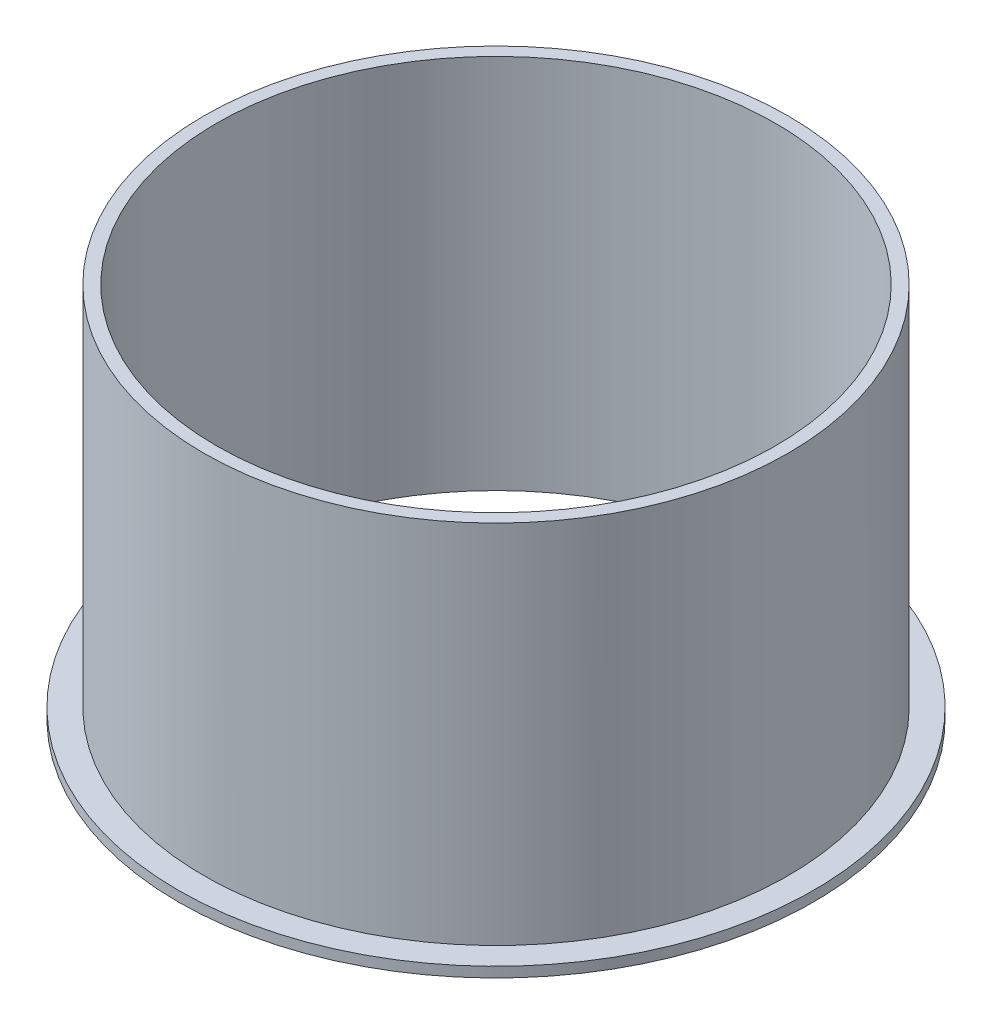
ISO-10303-21;
HEADER;
FILE_DESCRIPTION(('STEP AP214'),'2;1');
FILE_NAME('part.step','',(''),(''),'','','');
FILE_SCHEMA(('AUTOMOTIVE_DESIGN { 1 0 10303 214 1 1 1 1 }'));
ENDSEC;
DATA;
#1=APPLICATION_CONTEXT('core data for automotive mechanical design processes');
#2=APPLICATION_PROTOCOL_DEFINITION('international standard','automotive_design',2000,#1);
#3=PRODUCT_CONTEXT('',#1,'mechanical');
#4=PRODUCT('Part','Part','',(#3));
#5=PRODUCT_RELATED_PRODUCT_CATEGORY('part','',(#4));
#6=PRODUCT_DEFINITION_FORMATION('','',#4);
#7=PRODUCT_DEFINITION_CONTEXT('part definition',#1,'design');
#8=PRODUCT_DEFINITION('design','',#6,#7);
#9=PRODUCT_DEFINITION_SHAPE('','',#8);
#10=(LENGTH_UNIT() NAMED_UNIT(*) SI_UNIT(.MILLI.,.METRE.));
#11=(NAMED_UNIT(*) PLANE_ANGLE_UNIT() SI_UNIT($,.RADIAN.));
#12=(NAMED_UNIT(*) SI_UNIT($,.STERADIAN.) SOLID_ANGLE_UNIT());
#13=UNCERTAINTY_MEASURE_WITH_UNIT(LENGTH_MEASURE(1.E-05),#10,'distance_accuracy_value','');
#14=(GEOMETRIC_REPRESENTATION_CONTEXT(3) GLOBAL_UNCERTAINTY_ASSIGNED_CONTEXT((#13)) GLOBAL_UNIT_ASSIGNED_CONTEXT((#10,
#11,#12)) REPRESENTATION_CONTEXT('',''));
#15=CARTESIAN_POINT('',(0.,0.,0.));
#16=DIRECTION('',(0.,0.,1.));
#17=DIRECTION('',(1.,0.,0.));
#18=AXIS2_PLACEMENT_3D('',#15,#16,#17);
#19=CARTESIAN_POINT('',(0.,74.,0.));
#20=DIRECTION('',(0.,-1.,0.));
#21=DIRECTION('',(0.,0.,-1.));
#22=AXIS2_PLACEMENT_3D('',#19,#20,#21);
#23=CYLINDRICAL_SURFACE('',#22,57.5);
#24=CARTESIAN_POINT('',(0.,74.,0.));
#25=DIRECTION('',(0.,1.,0.));
#26=DIRECTION('',(0.,0.,1.));
#27=AXIS2_PLACEMENT_3D('',#24,#25,#26);
#28=CIRCLE('',#27,57.5);
#29=CARTESIAN_POINT('',(0.,74.,57.5));
#30=VERTEX_POINT('',#29);
#31=EDGE_CURVE('E44',#30,#30,#28,.T.);
#32=ORIENTED_EDGE('',*,*,#31,.F.);
#33=EDGE_LOOP('',(#32));
#34=FACE_BOUND('',#33,.T.);
#35=CARTESIAN_POINT('',(0.,2.,0.));
#36=DIRECTION('',(0.,-1.,0.));
#37=DIRECTION('',(0.,0.,-1.));
#38=AXIS2_PLACEMENT_3D('',#35,#36,#37);
#39=CIRCLE('',#38,57.5);
#40=CARTESIAN_POINT('',(0.,2.,-57.5));
#41=VERTEX_POINT('',#40);
#42=EDGE_CURVE('E10',#41,#41,#39,.T.);
#43=ORIENTED_EDGE('',*,*,#42,.F.);
#44=EDGE_LOOP('',(#43));
#45=FACE_BOUND('',#44,.T.);
#46=ADVANCED_FACE('F37',(#34,#45),#23,.T.);
#47=CARTESIAN_POINT('',(0.,74.,0.));
#48=DIRECTION('',(0.,1.,0.));
#49=DIRECTION('',(0.,0.,1.));
#50=AXIS2_PLACEMENT_3D('',#47,#48,#49);
#51=PLANE('',#50);
#52=ORIENTED_EDGE('',*,*,#31,.T.);
#53=EDGE_LOOP('',(#52));
#54=FACE_BOUND('',#53,.T.);
#55=CARTESIAN_POINT('',(0.,74.,0.));
#56=DIRECTION('',(0.,1.,0.));
#57=DIRECTION('',(0.,0.,1.));
#58=AXIS2_PLACEMENT_3D('',#55,#56,#57);
#59=CIRCLE('',#58,55.);
#60=CARTESIAN_POINT('',(0.,74.,55.));
#61=VERTEX_POINT('',#60);
#62=EDGE_CURVE('E49',#61,#61,#59,.T.);
#63=ORIENTED_EDGE('',*,*,#62,.F.);
#64=EDGE_LOOP('',(#63));
#65=FACE_BOUND('',#64,.T.);
#66=ADVANCED_FACE('F81',(#54,#65),#51,.T.);
#67=CARTESIAN_POINT('',(0.,0.,0.));
#68=DIRECTION('',(0.,1.,0.));
#69=DIRECTION('',(0.,0.,1.));
#70=AXIS2_PLACEMENT_3D('',#67,#68,#69);
#71=PLANE('',#70);
#72=CARTESIAN_POINT('',(0.,0.,0.));
#73=DIRECTION('',(0.,1.,0.));
#74=DIRECTION('',(0.,0.,1.));
#75=AXIS2_PLACEMENT_3D('',#72,#73,#74);
#76=CIRCLE('',#75,55.);
#77=CARTESIAN_POINT('',(0.,0.,55.));
#78=VERTEX_POINT('',#77);
#79=EDGE_CURVE('E54',#78,#78,#76,.T.);
#80=ORIENTED_EDGE('',*,*,#79,.T.);
#81=EDGE_LOOP('',(#80));
#82=FACE_BOUND('',#81,.T.);
#83=CARTESIAN_POINT('',(0.,0.,0.));
#84=DIRECTION('',(0.,-1.,0.));
#85=DIRECTION('',(0.,0.,-1.));
#86=AXIS2_PLACEMENT_3D('',#83,#84,#85);
#87=CIRCLE('',#86,62.5);
#88=CARTESIAN_POINT('',(0.,0.,-62.5));
#89=VERTEX_POINT('',#88);
#90=EDGE_CURVE('E61',#89,#89,#87,.T.);
#91=ORIENTED_EDGE('',*,*,#90,.T.);
#92=EDGE_LOOP('',(#91));
#93=FACE_BOUND('',#92,.T.);
#94=ADVANCED_FACE('F88',(#82,#93),#71,.F.);
#95=CARTESIAN_POINT('',(0.,74.,0.));
#96=DIRECTION('',(0.,-1.,0.));
#97=DIRECTION('',(0.,0.,-1.));
#98=AXIS2_PLACEMENT_3D('',#95,#96,#97);
#99=CYLINDRICAL_SURFACE('',#98,55.);
#100=ORIENTED_EDGE('',*,*,#62,.T.);
#101=EDGE_LOOP('',(#100));
#102=FACE_BOUND('',#101,.T.);
#103=ORIENTED_EDGE('',*,*,#79,.F.);
#104=EDGE_LOOP('',(#103));
#105=FACE_BOUND('',#104,.T.);
#106=ADVANCED_FACE('F78',(#102,#105),#99,.F.);
#107=CARTESIAN_POINT('',(0.,2.,0.));
#108=DIRECTION('',(0.,-1.,0.));
#109=DIRECTION('',(0.,0.,-1.));
#110=AXIS2_PLACEMENT_3D('',#107,#108,#109);
#111=CYLINDRICAL_SURFACE('',#110,62.5);
#112=CARTESIAN_POINT('',(0.,2.,0.));
#113=DIRECTION('',(0.,-1.,0.));
#114=DIRECTION('',(0.,0.,-1.));
#115=AXIS2_PLACEMENT_3D('',#112,#113,#114);
#116=CIRCLE('',#115,62.5);
#117=CARTESIAN_POINT('',(0.,2.,-62.5));
#118=VERTEX_POINT('',#117);
#119=EDGE_CURVE('E59',#118,#118,#116,.T.);
#120=ORIENTED_EDGE('',*,*,#119,.T.);
#121=EDGE_LOOP('',(#120));
#122=FACE_BOUND('',#121,.T.);
#123=ORIENTED_EDGE('',*,*,#90,.F.);
#124=EDGE_LOOP('',(#123));
#125=FACE_BOUND('',#124,.T.);
#126=ADVANCED_FACE('F69',(#122,#125),#111,.T.);
#127=CARTESIAN_POINT('',(0.,2.,0.));
#128=DIRECTION('',(0.,-1.,0.));
#129=DIRECTION('',(0.,0.,-1.));
#130=AXIS2_PLACEMENT_3D('',#127,#128,#129);
#131=PLANE('',#130);
#132=ORIENTED_EDGE('',*,*,#42,.T.);
#133=EDGE_LOOP('',(#132));
#134=FACE_BOUND('',#133,.T.);
#135=ORIENTED_EDGE('',*,*,#119,.F.);
#136=EDGE_LOOP('',(#135));
#137=FACE_BOUND('',#136,.T.);
#138=ADVANCED_FACE('F72',(#134,#137),#131,.F.);
#139=CLOSED_SHELL('',(#46,#66,#94,#106,#126,#138));
#140=MANIFOLD_SOLID_BREP('B2',#139);
#141=ADVANCED_BREP_SHAPE_REPRESENTATION('',(#18,#140),#14);
#142=SHAPE_DEFINITION_REPRESENTATION(#9,#141);
ENDSEC;
END-ISO-10303-21;
